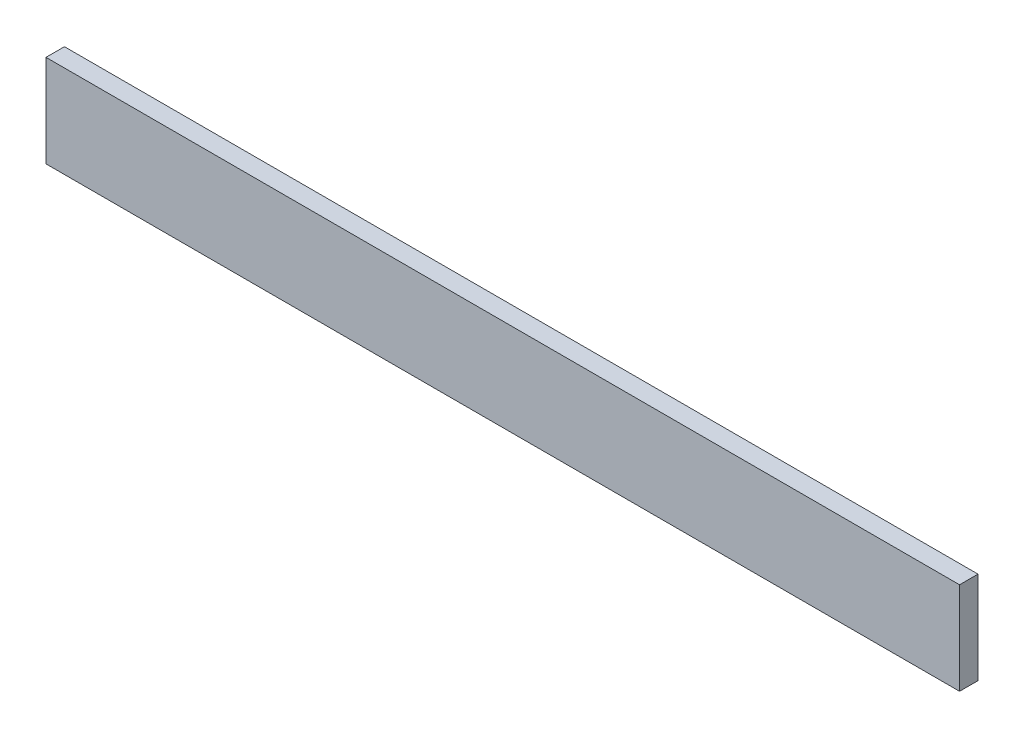
ISO-10303-21;
HEADER;
FILE_DESCRIPTION(('STEP AP214'),'2;1');
FILE_NAME('part.step','',(''),(''),'','','');
FILE_SCHEMA(('AUTOMOTIVE_DESIGN { 1 0 10303 214 1 1 1 1 }'));
ENDSEC;
DATA;
#1=APPLICATION_CONTEXT('core data for automotive mechanical design processes');
#2=APPLICATION_PROTOCOL_DEFINITION('international standard','automotive_design',2000,#1);
#3=PRODUCT_CONTEXT('',#1,'mechanical');
#4=PRODUCT('Part','Part','',(#3));
#5=PRODUCT_RELATED_PRODUCT_CATEGORY('part','',(#4));
#6=PRODUCT_DEFINITION_FORMATION('','',#4);
#7=PRODUCT_DEFINITION_CONTEXT('part definition',#1,'design');
#8=PRODUCT_DEFINITION('design','',#6,#7);
#9=PRODUCT_DEFINITION_SHAPE('','',#8);
#10=(LENGTH_UNIT() NAMED_UNIT(*) SI_UNIT(.MILLI.,.METRE.));
#11=(NAMED_UNIT(*) PLANE_ANGLE_UNIT() SI_UNIT($,.RADIAN.));
#12=(NAMED_UNIT(*) SI_UNIT($,.STERADIAN.) SOLID_ANGLE_UNIT());
#13=UNCERTAINTY_MEASURE_WITH_UNIT(LENGTH_MEASURE(1.E-05),#10,'distance_accuracy_value','');
#14=(GEOMETRIC_REPRESENTATION_CONTEXT(3) GLOBAL_UNCERTAINTY_ASSIGNED_CONTEXT((#13)) GLOBAL_UNIT_ASSIGNED_CONTEXT((#10,
#11,#12)) REPRESENTATION_CONTEXT('',''));
#15=CARTESIAN_POINT('',(0.,0.,0.));
#16=DIRECTION('',(0.,0.,1.));
#17=DIRECTION('',(1.,0.,0.));
#18=AXIS2_PLACEMENT_3D('',#15,#16,#17);
#19=CARTESIAN_POINT('',(-247.850070721358,140.02828854314,10.));
#20=DIRECTION('',(1.,0.,0.));
#21=DIRECTION('',(0.,1.,0.));
#22=AXIS2_PLACEMENT_3D('',#19,#20,#21);
#23=PLANE('',#22);
#24=DIRECTION('',(0.,-1.,0.));
#25=VECTOR('',#24,1.);
#26=CARTESIAN_POINT('',(-247.850070721358,140.02828854314,0.));
#27=LINE('',#26,#25);
#28=CARTESIAN_POINT('',(-247.850070721358,140.02828854314,0.));
#29=VERTEX_POINT('',#28);
#30=CARTESIAN_POINT('',(-247.850070721358,90.02828854314,0.));
#31=VERTEX_POINT('',#30);
#32=EDGE_CURVE('E99',#29,#31,#27,.T.);
#33=ORIENTED_EDGE('',*,*,#32,.T.);
#34=DIRECTION('',(0.,0.,-1.));
#35=VECTOR('',#34,1.);
#36=CARTESIAN_POINT('',(-247.850070721358,90.02828854314,10.));
#37=LINE('',#36,#35);
#38=CARTESIAN_POINT('',(-247.850070721358,90.02828854314,10.));
#39=VERTEX_POINT('',#38);
#40=EDGE_CURVE('E11',#39,#31,#37,.T.);
#41=ORIENTED_EDGE('',*,*,#40,.F.);
#42=DIRECTION('',(0.,-1.,0.));
#43=VECTOR('',#42,1.);
#44=CARTESIAN_POINT('',(-247.850070721358,140.02828854314,10.));
#45=LINE('',#44,#43);
#46=CARTESIAN_POINT('',(-247.850070721358,140.02828854314,10.));
#47=VERTEX_POINT('',#46);
#48=EDGE_CURVE('E87',#47,#39,#45,.T.);
#49=ORIENTED_EDGE('',*,*,#48,.F.);
#50=DIRECTION('',(0.,0.,-1.));
#51=VECTOR('',#50,1.);
#52=CARTESIAN_POINT('',(-247.850070721358,140.02828854314,10.));
#53=LINE('',#52,#51);
#54=EDGE_CURVE('E95',#47,#29,#53,.T.);
#55=ORIENTED_EDGE('',*,*,#54,.T.);
#56=EDGE_LOOP('',(#33,#41,#49,#55));
#57=FACE_BOUND('',#56,.T.);
#58=ADVANCED_FACE('F36',(#57),#23,.F.);
#59=CARTESIAN_POINT('',(-247.850070721358,90.02828854314,10.));
#60=DIRECTION('',(0.,1.,0.));
#61=DIRECTION('',(0.,0.,1.));
#62=AXIS2_PLACEMENT_3D('',#59,#60,#61);
#63=PLANE('',#62);
#64=DIRECTION('',(1.,0.,0.));
#65=VECTOR('',#64,1.);
#66=CARTESIAN_POINT('',(-247.850070721358,90.02828854314,0.));
#67=LINE('',#66,#65);
#68=CARTESIAN_POINT('',(247.149929278642,90.02828854314,0.));
#69=VERTEX_POINT('',#68);
#70=EDGE_CURVE('E91',#31,#69,#67,.T.);
#71=ORIENTED_EDGE('',*,*,#70,.T.);
#72=DIRECTION('',(0.,0.,-1.));
#73=VECTOR('',#72,1.);
#74=CARTESIAN_POINT('',(247.149929278642,90.02828854314,10.));
#75=LINE('',#74,#73);
#76=CARTESIAN_POINT('',(247.149929278642,90.02828854314,10.));
#77=VERTEX_POINT('',#76);
#78=EDGE_CURVE('E44',#77,#69,#75,.T.);
#79=ORIENTED_EDGE('',*,*,#78,.F.);
#80=DIRECTION('',(1.,0.,0.));
#81=VECTOR('',#80,1.);
#82=CARTESIAN_POINT('',(-247.850070721358,90.02828854314,10.));
#83=LINE('',#82,#81);
#84=EDGE_CURVE('E82',#39,#77,#83,.T.);
#85=ORIENTED_EDGE('',*,*,#84,.F.);
#86=ORIENTED_EDGE('',*,*,#40,.T.);
#87=EDGE_LOOP('',(#71,#79,#85,#86));
#88=FACE_BOUND('',#87,.T.);
#89=ADVANCED_FACE('F90',(#88),#63,.F.);
#90=CARTESIAN_POINT('',(247.149929278642,140.02828854314,10.));
#91=DIRECTION('',(-1.,0.,0.));
#92=DIRECTION('',(0.,-1.,0.));
#93=AXIS2_PLACEMENT_3D('',#90,#91,#92);
#94=PLANE('',#93);
#95=DIRECTION('',(0.,1.,0.));
#96=VECTOR('',#95,1.);
#97=CARTESIAN_POINT('',(247.149929278642,140.02828854314,0.));
#98=LINE('',#97,#96);
#99=CARTESIAN_POINT('',(247.149929278642,140.02828854314,0.));
#100=VERTEX_POINT('',#99);
#101=EDGE_CURVE('E69',#69,#100,#98,.T.);
#102=ORIENTED_EDGE('',*,*,#101,.T.);
#103=DIRECTION('',(0.,0.,-1.));
#104=VECTOR('',#103,1.);
#105=CARTESIAN_POINT('',(247.149929278642,140.02828854314,10.));
#106=LINE('',#105,#104);
#107=CARTESIAN_POINT('',(247.149929278642,140.02828854314,10.));
#108=VERTEX_POINT('',#107);
#109=EDGE_CURVE('E92',#108,#100,#106,.T.);
#110=ORIENTED_EDGE('',*,*,#109,.F.);
#111=DIRECTION('',(0.,1.,0.));
#112=VECTOR('',#111,1.);
#113=CARTESIAN_POINT('',(247.149929278642,140.02828854314,10.));
#114=LINE('',#113,#112);
#115=EDGE_CURVE('E85',#77,#108,#114,.T.);
#116=ORIENTED_EDGE('',*,*,#115,.F.);
#117=ORIENTED_EDGE('',*,*,#78,.T.);
#118=EDGE_LOOP('',(#102,#110,#116,#117));
#119=FACE_BOUND('',#118,.T.);
#120=ADVANCED_FACE('F93',(#119),#94,.F.);
#121=CARTESIAN_POINT('',(-247.850070721358,140.02828854314,10.));
#122=DIRECTION('',(0.,-1.,0.));
#123=DIRECTION('',(0.,0.,-1.));
#124=AXIS2_PLACEMENT_3D('',#121,#122,#123);
#125=PLANE('',#124);
#126=DIRECTION('',(-1.,0.,0.));
#127=VECTOR('',#126,1.);
#128=CARTESIAN_POINT('',(-247.850070721358,140.02828854314,0.));
#129=LINE('',#128,#127);
#130=EDGE_CURVE('E75',#100,#29,#129,.T.);
#131=ORIENTED_EDGE('',*,*,#130,.T.);
#132=ORIENTED_EDGE('',*,*,#54,.F.);
#133=DIRECTION('',(-1.,0.,0.));
#134=VECTOR('',#133,1.);
#135=CARTESIAN_POINT('',(-247.850070721358,140.02828854314,10.));
#136=LINE('',#135,#134);
#137=EDGE_CURVE('E52',#108,#47,#136,.T.);
#138=ORIENTED_EDGE('',*,*,#137,.F.);
#139=ORIENTED_EDGE('',*,*,#109,.T.);
#140=EDGE_LOOP('',(#131,#132,#138,#139));
#141=FACE_BOUND('',#140,.T.);
#142=ADVANCED_FACE('F106',(#141),#125,.F.);
#143=CARTESIAN_POINT('',(0.,0.,10.));
#144=DIRECTION('',(0.,0.,1.));
#145=DIRECTION('',(1.,0.,0.));
#146=AXIS2_PLACEMENT_3D('',#143,#144,#145);
#147=PLANE('',#146);
#148=ORIENTED_EDGE('',*,*,#48,.T.);
#149=ORIENTED_EDGE('',*,*,#84,.T.);
#150=ORIENTED_EDGE('',*,*,#115,.T.);
#151=ORIENTED_EDGE('',*,*,#137,.T.);
#152=EDGE_LOOP('',(#148,#149,#150,#151));
#153=FACE_BOUND('',#152,.T.);
#154=ADVANCED_FACE('F83',(#153),#147,.T.);
#155=CARTESIAN_POINT('',(0.,0.,0.));
#156=DIRECTION('',(0.,0.,1.));
#157=DIRECTION('',(1.,0.,0.));
#158=AXIS2_PLACEMENT_3D('',#155,#156,#157);
#159=PLANE('',#158);
#160=ORIENTED_EDGE('',*,*,#32,.F.);
#161=ORIENTED_EDGE('',*,*,#130,.F.);
#162=ORIENTED_EDGE('',*,*,#101,.F.);
#163=ORIENTED_EDGE('',*,*,#70,.F.);
#164=EDGE_LOOP('',(#160,#161,#162,#163));
#165=FACE_BOUND('',#164,.T.);
#166=ADVANCED_FACE('F109',(#165),#159,.F.);
#167=CLOSED_SHELL('',(#58,#89,#120,#142,#154,#166));
#168=MANIFOLD_SOLID_BREP('B2',#167);
#169=ADVANCED_BREP_SHAPE_REPRESENTATION('',(#18,#168),#14);
#170=SHAPE_DEFINITION_REPRESENTATION(#9,#169);
ENDSEC;
END-ISO-10303-21;
